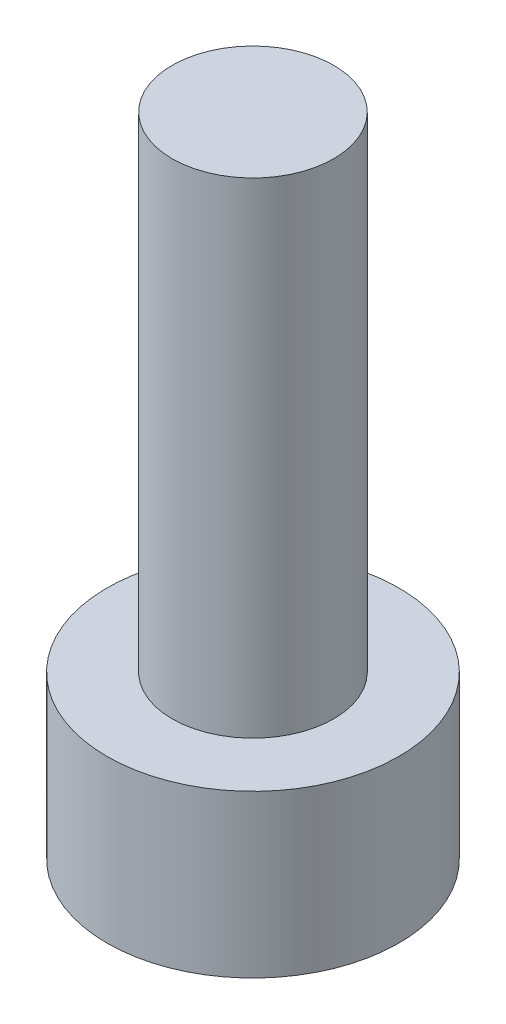
ISO-10303-21;
HEADER;
FILE_DESCRIPTION(('STEP AP214'),'2;1');
FILE_NAME('part.step','',(''),(''),'','','');
FILE_SCHEMA(('AUTOMOTIVE_DESIGN { 1 0 10303 214 1 1 1 1 }'));
ENDSEC;
DATA;
#1=APPLICATION_CONTEXT('core data for automotive mechanical design processes');
#2=APPLICATION_PROTOCOL_DEFINITION('international standard','automotive_design',2000,#1);
#3=PRODUCT_CONTEXT('',#1,'mechanical');
#4=PRODUCT('Part','Part','',(#3));
#5=PRODUCT_RELATED_PRODUCT_CATEGORY('part','',(#4));
#6=PRODUCT_DEFINITION_FORMATION('','',#4);
#7=PRODUCT_DEFINITION_CONTEXT('part definition',#1,'design');
#8=PRODUCT_DEFINITION('design','',#6,#7);
#9=PRODUCT_DEFINITION_SHAPE('','',#8);
#10=(LENGTH_UNIT() NAMED_UNIT(*) SI_UNIT(.MILLI.,.METRE.));
#11=(NAMED_UNIT(*) PLANE_ANGLE_UNIT() SI_UNIT($,.RADIAN.));
#12=(NAMED_UNIT(*) SI_UNIT($,.STERADIAN.) SOLID_ANGLE_UNIT());
#13=UNCERTAINTY_MEASURE_WITH_UNIT(LENGTH_MEASURE(1.E-05),#10,'distance_accuracy_value','');
#14=(GEOMETRIC_REPRESENTATION_CONTEXT(3) GLOBAL_UNCERTAINTY_ASSIGNED_CONTEXT((#13)) GLOBAL_UNIT_ASSIGNED_CONTEXT((#10,
#11,#12)) REPRESENTATION_CONTEXT('',''));
#15=CARTESIAN_POINT('',(0.,0.,0.));
#16=DIRECTION('',(0.,0.,1.));
#17=DIRECTION('',(1.,0.,0.));
#18=AXIS2_PLACEMENT_3D('',#15,#16,#17);
#19=CARTESIAN_POINT('',(0.,4.,0.));
#20=DIRECTION('',(0.,-1.,0.));
#21=DIRECTION('',(0.,0.,-1.));
#22=AXIS2_PLACEMENT_3D('',#19,#20,#21);
#23=CYLINDRICAL_SURFACE('',#22,3.61);
#24=CARTESIAN_POINT('',(0.,4.,0.));
#25=DIRECTION('',(0.,1.,0.));
#26=DIRECTION('',(0.,0.,1.));
#27=AXIS2_PLACEMENT_3D('',#24,#25,#26);
#28=CIRCLE('',#27,3.61);
#29=CARTESIAN_POINT('',(0.,4.,3.61));
#30=VERTEX_POINT('',#29);
#31=EDGE_CURVE('E51',#30,#30,#28,.T.);
#32=ORIENTED_EDGE('',*,*,#31,.F.);
#33=EDGE_LOOP('',(#32));
#34=FACE_BOUND('',#33,.T.);
#35=CARTESIAN_POINT('',(0.,0.,0.));
#36=DIRECTION('',(0.,1.,0.));
#37=DIRECTION('',(0.,0.,1.));
#38=AXIS2_PLACEMENT_3D('',#35,#36,#37);
#39=CIRCLE('',#38,3.61);
#40=CARTESIAN_POINT('',(0.,0.,3.61));
#41=VERTEX_POINT('',#40);
#42=EDGE_CURVE('E46',#41,#41,#39,.T.);
#43=ORIENTED_EDGE('',*,*,#42,.T.);
#44=EDGE_LOOP('',(#43));
#45=FACE_BOUND('',#44,.T.);
#46=ADVANCED_FACE('F43',(#34,#45),#23,.T.);
#47=CARTESIAN_POINT('',(0.,4.,0.));
#48=DIRECTION('',(0.,1.,0.));
#49=DIRECTION('',(0.,0.,1.));
#50=AXIS2_PLACEMENT_3D('',#47,#48,#49);
#51=PLANE('',#50);
#52=CARTESIAN_POINT('',(0.,4.,0.));
#53=DIRECTION('',(0.,1.,0.));
#54=DIRECTION('',(0.,0.,1.));
#55=AXIS2_PLACEMENT_3D('',#52,#53,#54);
#56=CIRCLE('',#55,2.);
#57=CARTESIAN_POINT('',(0.,4.,2.));
#58=VERTEX_POINT('',#57);
#59=EDGE_CURVE('E11',#58,#58,#56,.T.);
#60=ORIENTED_EDGE('',*,*,#59,.F.);
#61=EDGE_LOOP('',(#60));
#62=FACE_BOUND('',#61,.T.);
#63=ORIENTED_EDGE('',*,*,#31,.T.);
#64=EDGE_LOOP('',(#63));
#65=FACE_BOUND('',#64,.T.);
#66=ADVANCED_FACE('F161',(#62,#65),#51,.T.);
#67=CARTESIAN_POINT('',(0.,0.,0.));
#68=DIRECTION('',(0.,1.,0.));
#69=DIRECTION('',(0.,0.,1.));
#70=AXIS2_PLACEMENT_3D('',#67,#68,#69);
#71=PLANE('',#70);
#72=DIRECTION('',(-0.5,0.,0.866025403784438));
#73=VECTOR('',#72,1.);
#74=CARTESIAN_POINT('',(1.73205080756888,0.,0.));
#75=LINE('',#74,#73);
#76=CARTESIAN_POINT('',(1.73205080756888,0.,0.));
#77=VERTEX_POINT('',#76);
#78=CARTESIAN_POINT('',(0.866025403784438,0.,1.5));
#79=VERTEX_POINT('',#78);
#80=EDGE_CURVE('E133',#77,#79,#75,.T.);
#81=ORIENTED_EDGE('',*,*,#80,.F.);
#82=DIRECTION('',(0.5,0.,0.866025403784439));
#83=VECTOR('',#82,1.);
#84=CARTESIAN_POINT('',(0.866025403784439,0.,-1.5));
#85=LINE('',#84,#83);
#86=CARTESIAN_POINT('',(0.866025403784439,0.,-1.5));
#87=VERTEX_POINT('',#86);
#88=EDGE_CURVE('E59',#87,#77,#85,.T.);
#89=ORIENTED_EDGE('',*,*,#88,.F.);
#90=DIRECTION('',(1.,0.,0.));
#91=VECTOR('',#90,1.);
#92=CARTESIAN_POINT('',(-0.866025403784439,0.,-1.5));
#93=LINE('',#92,#91);
#94=CARTESIAN_POINT('',(-0.866025403784439,0.,-1.5));
#95=VERTEX_POINT('',#94);
#96=EDGE_CURVE('E143',#95,#87,#93,.T.);
#97=ORIENTED_EDGE('',*,*,#96,.F.);
#98=DIRECTION('',(0.5,0.,-0.866025403784439));
#99=VECTOR('',#98,1.);
#100=CARTESIAN_POINT('',(-1.73205080756888,0.,0.));
#101=LINE('',#100,#99);
#102=CARTESIAN_POINT('',(-1.73205080756888,0.,0.));
#103=VERTEX_POINT('',#102);
#104=EDGE_CURVE('E141',#103,#95,#101,.T.);
#105=ORIENTED_EDGE('',*,*,#104,.F.);
#106=DIRECTION('',(-0.5,0.,-0.866025403784439));
#107=VECTOR('',#106,1.);
#108=CARTESIAN_POINT('',(-0.866025403784439,0.,1.5));
#109=LINE('',#108,#107);
#110=CARTESIAN_POINT('',(-0.866025403784439,0.,1.5));
#111=VERTEX_POINT('',#110);
#112=EDGE_CURVE('E107',#111,#103,#109,.T.);
#113=ORIENTED_EDGE('',*,*,#112,.F.);
#114=DIRECTION('',(-1.,0.,0.));
#115=VECTOR('',#114,1.);
#116=CARTESIAN_POINT('',(0.866025403784438,0.,1.5));
#117=LINE('',#116,#115);
#118=EDGE_CURVE('E137',#79,#111,#117,.T.);
#119=ORIENTED_EDGE('',*,*,#118,.F.);
#120=EDGE_LOOP('',(#81,#89,#97,#105,#113,#119));
#121=FACE_BOUND('',#120,.T.);
#122=ORIENTED_EDGE('',*,*,#42,.F.);
#123=EDGE_LOOP('',(#122));
#124=FACE_BOUND('',#123,.T.);
#125=ADVANCED_FACE('F158',(#121,#124),#71,.F.);
#126=CARTESIAN_POINT('',(0.866025403784439,2.,-1.5));
#127=DIRECTION('',(0.866025403784439,0.,-0.5));
#128=DIRECTION('',(-0.5,0.,-0.866025403784439));
#129=AXIS2_PLACEMENT_3D('',#126,#127,#128);
#130=PLANE('',#129);
#131=ORIENTED_EDGE('',*,*,#88,.T.);
#132=DIRECTION('',(0.,-1.,0.));
#133=VECTOR('',#132,1.);
#134=CARTESIAN_POINT('',(1.73205080756888,2.,0.));
#135=LINE('',#134,#133);
#136=CARTESIAN_POINT('',(1.73205080756888,2.,0.));
#137=VERTEX_POINT('',#136);
#138=EDGE_CURVE('E89',#137,#77,#135,.T.);
#139=ORIENTED_EDGE('',*,*,#138,.F.);
#140=DIRECTION('',(0.5,0.,0.866025403784439));
#141=VECTOR('',#140,1.);
#142=CARTESIAN_POINT('',(0.866025403784439,2.,-1.5));
#143=LINE('',#142,#141);
#144=CARTESIAN_POINT('',(0.866025403784439,2.,-1.5));
#145=VERTEX_POINT('',#144);
#146=EDGE_CURVE('E145',#145,#137,#143,.T.);
#147=ORIENTED_EDGE('',*,*,#146,.F.);
#148=DIRECTION('',(0.,-1.,0.));
#149=VECTOR('',#148,1.);
#150=CARTESIAN_POINT('',(0.866025403784439,2.,-1.5));
#151=LINE('',#150,#149);
#152=EDGE_CURVE('E67',#145,#87,#151,.T.);
#153=ORIENTED_EDGE('',*,*,#152,.T.);
#154=EDGE_LOOP('',(#131,#139,#147,#153));
#155=FACE_BOUND('',#154,.T.);
#156=ADVANCED_FACE('F160',(#155),#130,.F.);
#157=CARTESIAN_POINT('',(-0.866025403784439,2.,-1.5));
#158=DIRECTION('',(0.,0.,-1.));
#159=DIRECTION('',(-1.,0.,0.));
#160=AXIS2_PLACEMENT_3D('',#157,#158,#159);
#161=PLANE('',#160);
#162=ORIENTED_EDGE('',*,*,#96,.T.);
#163=ORIENTED_EDGE('',*,*,#152,.F.);
#164=DIRECTION('',(1.,0.,0.));
#165=VECTOR('',#164,1.);
#166=CARTESIAN_POINT('',(-0.866025403784439,2.,-1.5));
#167=LINE('',#166,#165);
#168=CARTESIAN_POINT('',(-0.866025403784439,2.,-1.5));
#169=VERTEX_POINT('',#168);
#170=EDGE_CURVE('E119',#169,#145,#167,.T.);
#171=ORIENTED_EDGE('',*,*,#170,.F.);
#172=DIRECTION('',(0.,-1.,0.));
#173=VECTOR('',#172,1.);
#174=CARTESIAN_POINT('',(-0.866025403784439,2.,-1.5));
#175=LINE('',#174,#173);
#176=EDGE_CURVE('E111',#169,#95,#175,.T.);
#177=ORIENTED_EDGE('',*,*,#176,.T.);
#178=EDGE_LOOP('',(#162,#163,#171,#177));
#179=FACE_BOUND('',#178,.T.);
#180=ADVANCED_FACE('F167',(#179),#161,.F.);
#181=CARTESIAN_POINT('',(-1.73205080756888,2.,0.));
#182=DIRECTION('',(-0.866025403784439,0.,-0.5));
#183=DIRECTION('',(-0.5,0.,0.866025403784439));
#184=AXIS2_PLACEMENT_3D('',#181,#182,#183);
#185=PLANE('',#184);
#186=ORIENTED_EDGE('',*,*,#104,.T.);
#187=ORIENTED_EDGE('',*,*,#176,.F.);
#188=DIRECTION('',(0.5,0.,-0.866025403784439));
#189=VECTOR('',#188,1.);
#190=CARTESIAN_POINT('',(-1.73205080756888,2.,0.));
#191=LINE('',#190,#189);
#192=CARTESIAN_POINT('',(-1.73205080756888,2.,0.));
#193=VERTEX_POINT('',#192);
#194=EDGE_CURVE('E115',#193,#169,#191,.T.);
#195=ORIENTED_EDGE('',*,*,#194,.F.);
#196=DIRECTION('',(0.,-1.,0.));
#197=VECTOR('',#196,1.);
#198=CARTESIAN_POINT('',(-1.73205080756888,2.,0.));
#199=LINE('',#198,#197);
#200=EDGE_CURVE('E100',#193,#103,#199,.T.);
#201=ORIENTED_EDGE('',*,*,#200,.T.);
#202=EDGE_LOOP('',(#186,#187,#195,#201));
#203=FACE_BOUND('',#202,.T.);
#204=ADVANCED_FACE('F116',(#203),#185,.F.);
#205=CARTESIAN_POINT('',(-0.866025403784439,2.,1.5));
#206=DIRECTION('',(-0.866025403784439,0.,0.5));
#207=DIRECTION('',(0.5,0.,0.866025403784439));
#208=AXIS2_PLACEMENT_3D('',#205,#206,#207);
#209=PLANE('',#208);
#210=ORIENTED_EDGE('',*,*,#112,.T.);
#211=ORIENTED_EDGE('',*,*,#200,.F.);
#212=DIRECTION('',(-0.5,0.,-0.866025403784439));
#213=VECTOR('',#212,1.);
#214=CARTESIAN_POINT('',(-0.866025403784439,2.,1.5));
#215=LINE('',#214,#213);
#216=CARTESIAN_POINT('',(-0.866025403784439,2.,1.5));
#217=VERTEX_POINT('',#216);
#218=EDGE_CURVE('E104',#217,#193,#215,.T.);
#219=ORIENTED_EDGE('',*,*,#218,.F.);
#220=DIRECTION('',(0.,-1.,0.));
#221=VECTOR('',#220,1.);
#222=CARTESIAN_POINT('',(-0.866025403784439,2.,1.5));
#223=LINE('',#222,#221);
#224=EDGE_CURVE('E112',#217,#111,#223,.T.);
#225=ORIENTED_EDGE('',*,*,#224,.T.);
#226=EDGE_LOOP('',(#210,#211,#219,#225));
#227=FACE_BOUND('',#226,.T.);
#228=ADVANCED_FACE('F102',(#227),#209,.F.);
#229=CARTESIAN_POINT('',(0.866025403784438,2.,1.5));
#230=DIRECTION('',(0.,0.,1.));
#231=DIRECTION('',(1.,0.,0.));
#232=AXIS2_PLACEMENT_3D('',#229,#230,#231);
#233=PLANE('',#232);
#234=ORIENTED_EDGE('',*,*,#118,.T.);
#235=ORIENTED_EDGE('',*,*,#224,.F.);
#236=DIRECTION('',(-1.,0.,0.));
#237=VECTOR('',#236,1.);
#238=CARTESIAN_POINT('',(0.866025403784438,2.,1.5));
#239=LINE('',#238,#237);
#240=CARTESIAN_POINT('',(0.866025403784438,2.,1.5));
#241=VERTEX_POINT('',#240);
#242=EDGE_CURVE('E125',#241,#217,#239,.T.);
#243=ORIENTED_EDGE('',*,*,#242,.F.);
#244=DIRECTION('',(0.,-1.,0.));
#245=VECTOR('',#244,1.);
#246=CARTESIAN_POINT('',(0.866025403784438,2.,1.5));
#247=LINE('',#246,#245);
#248=EDGE_CURVE('E149',#241,#79,#247,.T.);
#249=ORIENTED_EDGE('',*,*,#248,.T.);
#250=EDGE_LOOP('',(#234,#235,#243,#249));
#251=FACE_BOUND('',#250,.T.);
#252=ADVANCED_FACE('F207',(#251),#233,.F.);
#253=CARTESIAN_POINT('',(1.73205080756888,2.,0.));
#254=DIRECTION('',(0.866025403784439,0.,0.5));
#255=DIRECTION('',(0.5,0.,-0.866025403784438));
#256=AXIS2_PLACEMENT_3D('',#253,#254,#255);
#257=PLANE('',#256);
#258=ORIENTED_EDGE('',*,*,#80,.T.);
#259=ORIENTED_EDGE('',*,*,#248,.F.);
#260=DIRECTION('',(-0.5,0.,0.866025403784438));
#261=VECTOR('',#260,1.);
#262=CARTESIAN_POINT('',(1.73205080756888,2.,0.));
#263=LINE('',#262,#261);
#264=EDGE_CURVE('E127',#137,#241,#263,.T.);
#265=ORIENTED_EDGE('',*,*,#264,.F.);
#266=ORIENTED_EDGE('',*,*,#138,.T.);
#267=EDGE_LOOP('',(#258,#259,#265,#266));
#268=FACE_BOUND('',#267,.T.);
#269=ADVANCED_FACE('F214',(#268),#257,.F.);
#270=CARTESIAN_POINT('',(0.,2.,0.));
#271=DIRECTION('',(0.,-1.,0.));
#272=DIRECTION('',(0.,0.,-1.));
#273=AXIS2_PLACEMENT_3D('',#270,#271,#272);
#274=PLANE('',#273);
#275=ORIENTED_EDGE('',*,*,#146,.T.);
#276=ORIENTED_EDGE('',*,*,#264,.T.);
#277=ORIENTED_EDGE('',*,*,#242,.T.);
#278=ORIENTED_EDGE('',*,*,#218,.T.);
#279=ORIENTED_EDGE('',*,*,#194,.T.);
#280=ORIENTED_EDGE('',*,*,#170,.T.);
#281=EDGE_LOOP('',(#275,#276,#277,#278,#279,#280));
#282=FACE_BOUND('',#281,.T.);
#283=ADVANCED_FACE('F122',(#282),#274,.T.);
#284=CARTESIAN_POINT('',(0.,16.,0.));
#285=DIRECTION('',(0.,-1.,0.));
#286=DIRECTION('',(0.,0.,-1.));
#287=AXIS2_PLACEMENT_3D('',#284,#285,#286);
#288=CYLINDRICAL_SURFACE('',#287,2.);
#289=CARTESIAN_POINT('',(0.,16.,0.));
#290=DIRECTION('',(0.,1.,0.));
#291=DIRECTION('',(0.,0.,1.));
#292=AXIS2_PLACEMENT_3D('',#289,#290,#291);
#293=CIRCLE('',#292,2.);
#294=CARTESIAN_POINT('',(0.,16.,2.));
#295=VERTEX_POINT('',#294);
#296=EDGE_CURVE('E134',#295,#295,#293,.T.);
#297=ORIENTED_EDGE('',*,*,#296,.F.);
#298=EDGE_LOOP('',(#297));
#299=FACE_BOUND('',#298,.T.);
#300=ORIENTED_EDGE('',*,*,#59,.T.);
#301=EDGE_LOOP('',(#300));
#302=FACE_BOUND('',#301,.T.);
#303=ADVANCED_FACE('F228',(#299,#302),#288,.T.);
#304=CARTESIAN_POINT('',(0.,16.,0.));
#305=DIRECTION('',(0.,1.,0.));
#306=DIRECTION('',(0.,0.,1.));
#307=AXIS2_PLACEMENT_3D('',#304,#305,#306);
#308=PLANE('',#307);
#309=ORIENTED_EDGE('',*,*,#296,.T.);
#310=EDGE_LOOP('',(#309));
#311=FACE_BOUND('',#310,.T.);
#312=ADVANCED_FACE('F235',(#311),#308,.T.);
#313=CLOSED_SHELL('',(#46,#66,#125,#156,#180,#204,#228,#252,#269,#283,#303,#312));
#314=MANIFOLD_SOLID_BREP('B2',#313);
#315=ADVANCED_BREP_SHAPE_REPRESENTATION('',(#18,#314),#14);
#316=SHAPE_DEFINITION_REPRESENTATION(#9,#315);
ENDSEC;
END-ISO-10303-21;
